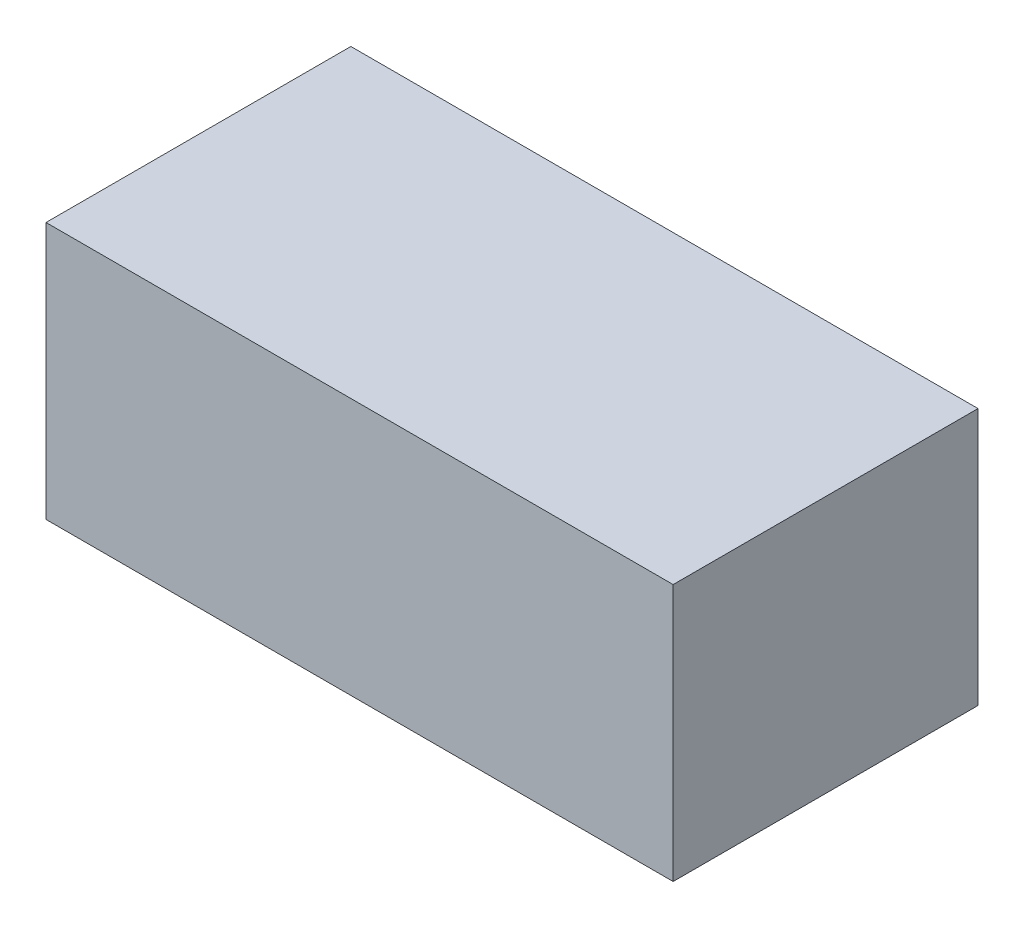
ISO-10303-21;
HEADER;
FILE_DESCRIPTION(('STEP AP214'),'2;1');
FILE_NAME('part.step','',(''),(''),'','','');
FILE_SCHEMA(('AUTOMOTIVE_DESIGN { 1 0 10303 214 1 1 1 1 }'));
ENDSEC;
DATA;
#1=APPLICATION_CONTEXT('core data for automotive mechanical design processes');
#2=APPLICATION_PROTOCOL_DEFINITION('international standard','automotive_design',2000,#1);
#3=PRODUCT_CONTEXT('',#1,'mechanical');
#4=PRODUCT('Part','Part','',(#3));
#5=PRODUCT_RELATED_PRODUCT_CATEGORY('part','',(#4));
#6=PRODUCT_DEFINITION_FORMATION('','',#4);
#7=PRODUCT_DEFINITION_CONTEXT('part definition',#1,'design');
#8=PRODUCT_DEFINITION('design','',#6,#7);
#9=PRODUCT_DEFINITION_SHAPE('','',#8);
#10=(LENGTH_UNIT() NAMED_UNIT(*) SI_UNIT(.MILLI.,.METRE.));
#11=(NAMED_UNIT(*) PLANE_ANGLE_UNIT() SI_UNIT($,.RADIAN.));
#12=(NAMED_UNIT(*) SI_UNIT($,.STERADIAN.) SOLID_ANGLE_UNIT());
#13=UNCERTAINTY_MEASURE_WITH_UNIT(LENGTH_MEASURE(1.E-05),#10,'distance_accuracy_value','');
#14=(GEOMETRIC_REPRESENTATION_CONTEXT(3) GLOBAL_UNCERTAINTY_ASSIGNED_CONTEXT((#13)) GLOBAL_UNIT_ASSIGNED_CONTEXT((#10,
#11,#12)) REPRESENTATION_CONTEXT('',''));
#15=CARTESIAN_POINT('',(0.,0.,0.));
#16=DIRECTION('',(0.,0.,1.));
#17=DIRECTION('',(1.,0.,0.));
#18=AXIS2_PLACEMENT_3D('',#15,#16,#17);
#19=CARTESIAN_POINT('',(914.4,750.,-444.5));
#20=DIRECTION('',(-1.,0.,0.));
#21=DIRECTION('',(0.,0.,1.));
#22=AXIS2_PLACEMENT_3D('',#19,#20,#21);
#23=PLANE('',#22);
#24=DIRECTION('',(0.,0.,-1.));
#25=VECTOR('',#24,1.);
#26=CARTESIAN_POINT('',(914.4,0.,-444.5));
#27=LINE('',#26,#25);
#28=CARTESIAN_POINT('',(914.4,0.,444.5));
#29=VERTEX_POINT('',#28);
#30=CARTESIAN_POINT('',(914.4,0.,-444.5));
#31=VERTEX_POINT('',#30);
#32=EDGE_CURVE('E100',#29,#31,#27,.T.);
#33=ORIENTED_EDGE('',*,*,#32,.T.);
#34=DIRECTION('',(0.,-1.,0.));
#35=VECTOR('',#34,1.);
#36=CARTESIAN_POINT('',(914.4,750.,-444.5));
#37=LINE('',#36,#35);
#38=CARTESIAN_POINT('',(914.4,750.,-444.5));
#39=VERTEX_POINT('',#38);
#40=EDGE_CURVE('E11',#39,#31,#37,.T.);
#41=ORIENTED_EDGE('',*,*,#40,.F.);
#42=DIRECTION('',(0.,0.,-1.));
#43=VECTOR('',#42,1.);
#44=CARTESIAN_POINT('',(914.4,750.,-444.5));
#45=LINE('',#44,#43);
#46=CARTESIAN_POINT('',(914.4,750.,444.5));
#47=VERTEX_POINT('',#46);
#48=EDGE_CURVE('E88',#47,#39,#45,.T.);
#49=ORIENTED_EDGE('',*,*,#48,.F.);
#50=DIRECTION('',(0.,-1.,0.));
#51=VECTOR('',#50,1.);
#52=CARTESIAN_POINT('',(914.4,750.,444.5));
#53=LINE('',#52,#51);
#54=EDGE_CURVE('E96',#47,#29,#53,.T.);
#55=ORIENTED_EDGE('',*,*,#54,.T.);
#56=EDGE_LOOP('',(#33,#41,#49,#55));
#57=FACE_BOUND('',#56,.T.);
#58=ADVANCED_FACE('F37',(#57),#23,.F.);
#59=CARTESIAN_POINT('',(-914.4,750.,-444.5));
#60=DIRECTION('',(0.,0.,1.));
#61=DIRECTION('',(1.,0.,0.));
#62=AXIS2_PLACEMENT_3D('',#59,#60,#61);
#63=PLANE('',#62);
#64=DIRECTION('',(-1.,0.,0.));
#65=VECTOR('',#64,1.);
#66=CARTESIAN_POINT('',(-914.4,0.,-444.5));
#67=LINE('',#66,#65);
#68=CARTESIAN_POINT('',(-914.4,0.,-444.5));
#69=VERTEX_POINT('',#68);
#70=EDGE_CURVE('E92',#31,#69,#67,.T.);
#71=ORIENTED_EDGE('',*,*,#70,.T.);
#72=DIRECTION('',(0.,-1.,0.));
#73=VECTOR('',#72,1.);
#74=CARTESIAN_POINT('',(-914.4,750.,-444.5));
#75=LINE('',#74,#73);
#76=CARTESIAN_POINT('',(-914.4,750.,-444.5));
#77=VERTEX_POINT('',#76);
#78=EDGE_CURVE('E45',#77,#69,#75,.T.);
#79=ORIENTED_EDGE('',*,*,#78,.F.);
#80=DIRECTION('',(-1.,0.,0.));
#81=VECTOR('',#80,1.);
#82=CARTESIAN_POINT('',(-914.4,750.,-444.5));
#83=LINE('',#82,#81);
#84=EDGE_CURVE('E83',#39,#77,#83,.T.);
#85=ORIENTED_EDGE('',*,*,#84,.F.);
#86=ORIENTED_EDGE('',*,*,#40,.T.);
#87=EDGE_LOOP('',(#71,#79,#85,#86));
#88=FACE_BOUND('',#87,.T.);
#89=ADVANCED_FACE('F91',(#88),#63,.F.);
#90=CARTESIAN_POINT('',(-914.4,750.,-444.5));
#91=DIRECTION('',(1.,0.,0.));
#92=DIRECTION('',(0.,0.,-1.));
#93=AXIS2_PLACEMENT_3D('',#90,#91,#92);
#94=PLANE('',#93);
#95=DIRECTION('',(0.,0.,1.));
#96=VECTOR('',#95,1.);
#97=CARTESIAN_POINT('',(-914.4,0.,-444.5));
#98=LINE('',#97,#96);
#99=CARTESIAN_POINT('',(-914.4,0.,444.5));
#100=VERTEX_POINT('',#99);
#101=EDGE_CURVE('E70',#69,#100,#98,.T.);
#102=ORIENTED_EDGE('',*,*,#101,.T.);
#103=DIRECTION('',(0.,-1.,0.));
#104=VECTOR('',#103,1.);
#105=CARTESIAN_POINT('',(-914.4,750.,444.5));
#106=LINE('',#105,#104);
#107=CARTESIAN_POINT('',(-914.4,750.,444.5));
#108=VERTEX_POINT('',#107);
#109=EDGE_CURVE('E93',#108,#100,#106,.T.);
#110=ORIENTED_EDGE('',*,*,#109,.F.);
#111=DIRECTION('',(0.,0.,1.));
#112=VECTOR('',#111,1.);
#113=CARTESIAN_POINT('',(-914.4,750.,-444.5));
#114=LINE('',#113,#112);
#115=EDGE_CURVE('E86',#77,#108,#114,.T.);
#116=ORIENTED_EDGE('',*,*,#115,.F.);
#117=ORIENTED_EDGE('',*,*,#78,.T.);
#118=EDGE_LOOP('',(#102,#110,#116,#117));
#119=FACE_BOUND('',#118,.T.);
#120=ADVANCED_FACE('F94',(#119),#94,.F.);
#121=CARTESIAN_POINT('',(-914.4,750.,444.5));
#122=DIRECTION('',(0.,0.,-1.));
#123=DIRECTION('',(-1.,0.,0.));
#124=AXIS2_PLACEMENT_3D('',#121,#122,#123);
#125=PLANE('',#124);
#126=DIRECTION('',(1.,0.,0.));
#127=VECTOR('',#126,1.);
#128=CARTESIAN_POINT('',(-914.4,0.,444.5));
#129=LINE('',#128,#127);
#130=EDGE_CURVE('E76',#100,#29,#129,.T.);
#131=ORIENTED_EDGE('',*,*,#130,.T.);
#132=ORIENTED_EDGE('',*,*,#54,.F.);
#133=DIRECTION('',(1.,0.,0.));
#134=VECTOR('',#133,1.);
#135=CARTESIAN_POINT('',(-914.4,750.,444.5));
#136=LINE('',#135,#134);
#137=EDGE_CURVE('E53',#108,#47,#136,.T.);
#138=ORIENTED_EDGE('',*,*,#137,.F.);
#139=ORIENTED_EDGE('',*,*,#109,.T.);
#140=EDGE_LOOP('',(#131,#132,#138,#139));
#141=FACE_BOUND('',#140,.T.);
#142=ADVANCED_FACE('F107',(#141),#125,.F.);
#143=CARTESIAN_POINT('',(0.,750.,0.));
#144=DIRECTION('',(0.,1.,0.));
#145=DIRECTION('',(0.,0.,1.));
#146=AXIS2_PLACEMENT_3D('',#143,#144,#145);
#147=PLANE('',#146);
#148=ORIENTED_EDGE('',*,*,#48,.T.);
#149=ORIENTED_EDGE('',*,*,#84,.T.);
#150=ORIENTED_EDGE('',*,*,#115,.T.);
#151=ORIENTED_EDGE('',*,*,#137,.T.);
#152=EDGE_LOOP('',(#148,#149,#150,#151));
#153=FACE_BOUND('',#152,.T.);
#154=ADVANCED_FACE('F84',(#153),#147,.T.);
#155=CARTESIAN_POINT('',(0.,0.,0.));
#156=DIRECTION('',(0.,1.,0.));
#157=DIRECTION('',(0.,0.,1.));
#158=AXIS2_PLACEMENT_3D('',#155,#156,#157);
#159=PLANE('',#158);
#160=ORIENTED_EDGE('',*,*,#32,.F.);
#161=ORIENTED_EDGE('',*,*,#130,.F.);
#162=ORIENTED_EDGE('',*,*,#101,.F.);
#163=ORIENTED_EDGE('',*,*,#70,.F.);
#164=EDGE_LOOP('',(#160,#161,#162,#163));
#165=FACE_BOUND('',#164,.T.);
#166=ADVANCED_FACE('F110',(#165),#159,.F.);
#167=CLOSED_SHELL('',(#58,#89,#120,#142,#154,#166));
#168=MANIFOLD_SOLID_BREP('B2',#167);
#169=ADVANCED_BREP_SHAPE_REPRESENTATION('',(#18,#168),#14);
#170=SHAPE_DEFINITION_REPRESENTATION(#9,#169);
ENDSEC;
END-ISO-10303-21;
